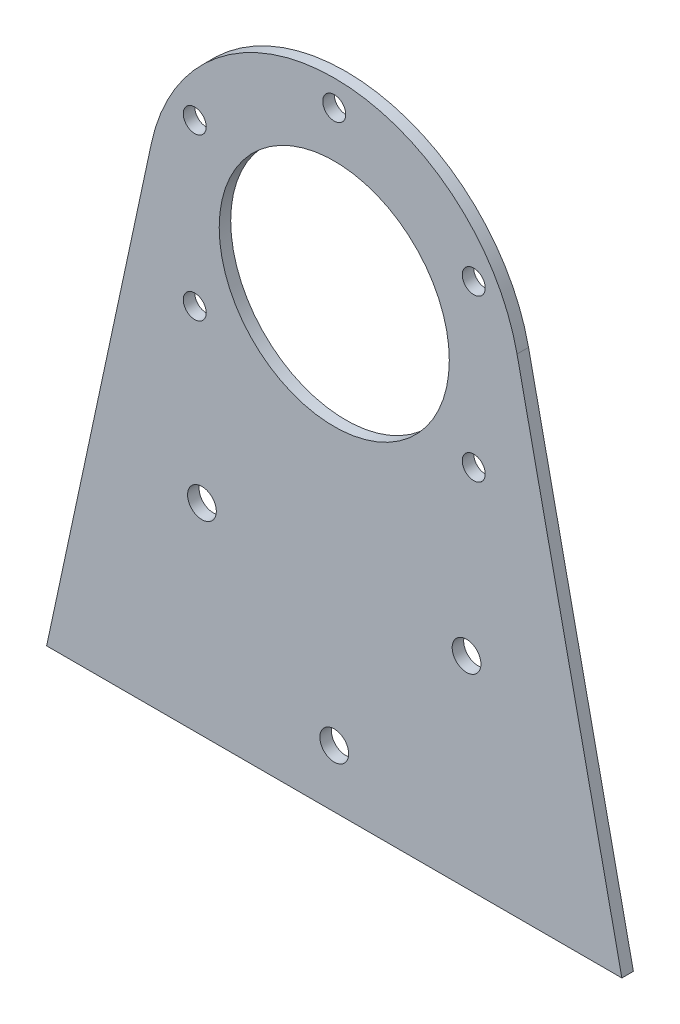
ISO-10303-21;
HEADER;
FILE_DESCRIPTION(('STEP AP214'),'2;1');
FILE_NAME('part.step','',(''),(''),'','','');
FILE_SCHEMA(('AUTOMOTIVE_DESIGN { 1 0 10303 214 1 1 1 1 }'));
ENDSEC;
DATA;
#1=APPLICATION_CONTEXT('core data for automotive mechanical design processes');
#2=APPLICATION_PROTOCOL_DEFINITION('international standard','automotive_design',2000,#1);
#3=PRODUCT_CONTEXT('',#1,'mechanical');
#4=PRODUCT('Part','Part','',(#3));
#5=PRODUCT_RELATED_PRODUCT_CATEGORY('part','',(#4));
#6=PRODUCT_DEFINITION_FORMATION('','',#4);
#7=PRODUCT_DEFINITION_CONTEXT('part definition',#1,'design');
#8=PRODUCT_DEFINITION('design','',#6,#7);
#9=PRODUCT_DEFINITION_SHAPE('','',#8);
#10=(LENGTH_UNIT() NAMED_UNIT(*) SI_UNIT(.MILLI.,.METRE.));
#11=(NAMED_UNIT(*) PLANE_ANGLE_UNIT() SI_UNIT($,.RADIAN.));
#12=(NAMED_UNIT(*) SI_UNIT($,.STERADIAN.) SOLID_ANGLE_UNIT());
#13=UNCERTAINTY_MEASURE_WITH_UNIT(LENGTH_MEASURE(1.E-05),#10,'distance_accuracy_value','');
#14=(GEOMETRIC_REPRESENTATION_CONTEXT(3) GLOBAL_UNCERTAINTY_ASSIGNED_CONTEXT((#13)) GLOBAL_UNIT_ASSIGNED_CONTEXT((#10,
#11,#12)) REPRESENTATION_CONTEXT('',''));
#15=CARTESIAN_POINT('',(0.,0.,0.));
#16=DIRECTION('',(0.,0.,1.));
#17=DIRECTION('',(1.,0.,0.));
#18=AXIS2_PLACEMENT_3D('',#15,#16,#17);
#19=CARTESIAN_POINT('',(0.,0.,2.));
#20=DIRECTION('',(0.,0.,1.));
#21=DIRECTION('',(1.,0.,0.));
#22=AXIS2_PLACEMENT_3D('',#19,#20,#21);
#23=PLANE('',#22);
#24=CARTESIAN_POINT('',(23.,-43.,2.));
#25=DIRECTION('',(0.,0.,1.));
#26=DIRECTION('',(1.,0.,0.));
#27=AXIS2_PLACEMENT_3D('',#24,#25,#26);
#28=CIRCLE('',#27,2.5);
#29=CARTESIAN_POINT('',(25.5,-43.,2.));
#30=VERTEX_POINT('',#29);
#31=EDGE_CURVE('E181',#30,#30,#28,.T.);
#32=ORIENTED_EDGE('',*,*,#31,.F.);
#33=EDGE_LOOP('',(#32));
#34=FACE_BOUND('',#33,.T.);
#35=CARTESIAN_POINT('',(-24.2487113059631,-14.0000000000007,2.));
#36=DIRECTION('',(0.,0.,1.));
#37=DIRECTION('',(1.,0.,0.));
#38=AXIS2_PLACEMENT_3D('',#35,#36,#37);
#39=CIRCLE('',#38,2.);
#40=CARTESIAN_POINT('',(-22.2487113059631,-14.0000000000007,2.));
#41=VERTEX_POINT('',#40);
#42=EDGE_CURVE('E165',#41,#41,#39,.T.);
#43=ORIENTED_EDGE('',*,*,#42,.F.);
#44=EDGE_LOOP('',(#43));
#45=FACE_BOUND('',#44,.T.);
#46=CARTESIAN_POINT('',(24.2487113059655,-13.9999999999993,2.));
#47=DIRECTION('',(0.,0.,1.));
#48=DIRECTION('',(1.,0.,0.));
#49=AXIS2_PLACEMENT_3D('',#46,#47,#48);
#50=CIRCLE('',#49,2.);
#51=CARTESIAN_POINT('',(26.2487113059655,-13.9999999999993,2.));
#52=VERTEX_POINT('',#51);
#53=EDGE_CURVE('E149',#52,#52,#50,.T.);
#54=ORIENTED_EDGE('',*,*,#53,.F.);
#55=EDGE_LOOP('',(#54));
#56=FACE_BOUND('',#55,.T.);
#57=CARTESIAN_POINT('',(0.,28.,2.));
#58=DIRECTION('',(0.,0.,1.));
#59=DIRECTION('',(1.,0.,0.));
#60=AXIS2_PLACEMENT_3D('',#57,#58,#59);
#61=CIRCLE('',#60,2.);
#62=CARTESIAN_POINT('',(2.,28.,2.));
#63=VERTEX_POINT('',#62);
#64=EDGE_CURVE('E133',#63,#63,#61,.T.);
#65=ORIENTED_EDGE('',*,*,#64,.F.);
#66=EDGE_LOOP('',(#65));
#67=FACE_BOUND('',#66,.T.);
#68=DIRECTION('',(-0.210057124610216,0.977689114391936,0.));
#69=VECTOR('',#68,1.);
#70=CARTESIAN_POINT('',(50.,-78.,2.));
#71=LINE('',#70,#69);
#72=CARTESIAN_POINT('',(50.,-78.,2.));
#73=VERTEX_POINT('',#72);
#74=CARTESIAN_POINT('',(31.7748962177379,6.82685654983201,2.));
#75=VERTEX_POINT('',#74);
#76=EDGE_CURVE('E88',#73,#75,#71,.T.);
#77=ORIENTED_EDGE('',*,*,#76,.T.);
#78=CARTESIAN_POINT('',(0.,0.,2.));
#79=DIRECTION('',(0.,0.,1.));
#80=DIRECTION('',(1.,0.,0.));
#81=AXIS2_PLACEMENT_3D('',#78,#79,#80);
#82=CIRCLE('',#81,32.5);
#83=CARTESIAN_POINT('',(-31.7748962177379,6.826856549832,2.));
#84=VERTEX_POINT('',#83);
#85=EDGE_CURVE('E83',#75,#84,#82,.T.);
#86=ORIENTED_EDGE('',*,*,#85,.T.);
#87=DIRECTION('',(-0.210057124610215,-0.977689114391936,0.));
#88=VECTOR('',#87,1.);
#89=CARTESIAN_POINT('',(-50.,-78.,2.));
#90=LINE('',#89,#88);
#91=CARTESIAN_POINT('',(-50.,-78.,2.));
#92=VERTEX_POINT('',#91);
#93=EDGE_CURVE('E86',#84,#92,#90,.T.);
#94=ORIENTED_EDGE('',*,*,#93,.T.);
#95=DIRECTION('',(1.,0.,0.));
#96=VECTOR('',#95,1.);
#97=CARTESIAN_POINT('',(-50.,-78.,2.));
#98=LINE('',#97,#96);
#99=EDGE_CURVE('E53',#92,#73,#98,.T.);
#100=ORIENTED_EDGE('',*,*,#99,.T.);
#101=EDGE_LOOP('',(#77,#86,#94,#100));
#102=FACE_BOUND('',#101,.T.);
#103=CARTESIAN_POINT('',(0.,0.,2.));
#104=DIRECTION('',(0.,0.,1.));
#105=DIRECTION('',(1.,0.,0.));
#106=AXIS2_PLACEMENT_3D('',#103,#104,#105);
#107=CIRCLE('',#106,20.);
#108=CARTESIAN_POINT('',(20.,0.,2.));
#109=VERTEX_POINT('',#108);
#110=EDGE_CURVE('E109',#109,#109,#107,.T.);
#111=ORIENTED_EDGE('',*,*,#110,.F.);
#112=EDGE_LOOP('',(#111));
#113=FACE_BOUND('',#112,.T.);
#114=CARTESIAN_POINT('',(24.2487113059647,14.0000000000007,2.));
#115=DIRECTION('',(0.,0.,1.));
#116=DIRECTION('',(1.,0.,0.));
#117=AXIS2_PLACEMENT_3D('',#114,#115,#116);
#118=CIRCLE('',#117,2.);
#119=CARTESIAN_POINT('',(26.2487113059647,14.0000000000007,2.));
#120=VERTEX_POINT('',#119);
#121=EDGE_CURVE('E141',#120,#120,#118,.T.);
#122=ORIENTED_EDGE('',*,*,#121,.F.);
#123=EDGE_LOOP('',(#122));
#124=FACE_BOUND('',#123,.T.);
#125=CARTESIAN_POINT('',(0.,-68.,2.));
#126=DIRECTION('',(0.,0.,1.));
#127=DIRECTION('',(1.,0.,0.));
#128=AXIS2_PLACEMENT_3D('',#125,#126,#127);
#129=CIRCLE('',#128,2.5);
#130=CARTESIAN_POINT('',(2.50000000000001,-68.,2.));
#131=VERTEX_POINT('',#130);
#132=EDGE_CURVE('E157',#131,#131,#129,.T.);
#133=ORIENTED_EDGE('',*,*,#132,.F.);
#134=EDGE_LOOP('',(#133));
#135=FACE_BOUND('',#134,.T.);
#136=CARTESIAN_POINT('',(-24.2487113059639,13.9999999999993,2.));
#137=DIRECTION('',(0.,0.,1.));
#138=DIRECTION('',(1.,0.,0.));
#139=AXIS2_PLACEMENT_3D('',#136,#137,#138);
#140=CIRCLE('',#139,2.);
#141=CARTESIAN_POINT('',(-22.2487113059639,13.9999999999993,2.));
#142=VERTEX_POINT('',#141);
#143=EDGE_CURVE('E173',#142,#142,#140,.T.);
#144=ORIENTED_EDGE('',*,*,#143,.F.);
#145=EDGE_LOOP('',(#144));
#146=FACE_BOUND('',#145,.T.);
#147=CARTESIAN_POINT('',(-23.,-43.,2.));
#148=DIRECTION('',(0.,0.,1.));
#149=DIRECTION('',(1.,0.,0.));
#150=AXIS2_PLACEMENT_3D('',#147,#148,#149);
#151=CIRCLE('',#150,2.5);
#152=CARTESIAN_POINT('',(-20.5,-43.,2.));
#153=VERTEX_POINT('',#152);
#154=EDGE_CURVE('E189',#153,#153,#151,.T.);
#155=ORIENTED_EDGE('',*,*,#154,.F.);
#156=EDGE_LOOP('',(#155));
#157=FACE_BOUND('',#156,.T.);
#158=ADVANCED_FACE('F35',(#34,#45,#56,#67,#102,#113,#124,#135,#146,#157),#23,.T.);
#159=CARTESIAN_POINT('',(0.,0.,0.));
#160=DIRECTION('',(0.,0.,1.));
#161=DIRECTION('',(1.,0.,0.));
#162=AXIS2_PLACEMENT_3D('',#159,#160,#161);
#163=PLANE('',#162);
#164=DIRECTION('',(-0.210057124610216,0.977689114391936,0.));
#165=VECTOR('',#164,1.);
#166=CARTESIAN_POINT('',(50.,-78.,0.));
#167=LINE('',#166,#165);
#168=CARTESIAN_POINT('',(50.,-78.,0.));
#169=VERTEX_POINT('',#168);
#170=CARTESIAN_POINT('',(31.7748962177379,6.82685654983201,0.));
#171=VERTEX_POINT('',#170);
#172=EDGE_CURVE('E105',#169,#171,#167,.T.);
#173=ORIENTED_EDGE('',*,*,#172,.F.);
#174=DIRECTION('',(1.,0.,0.));
#175=VECTOR('',#174,1.);
#176=CARTESIAN_POINT('',(-50.,-78.,0.));
#177=LINE('',#176,#175);
#178=CARTESIAN_POINT('',(-50.,-78.,0.));
#179=VERTEX_POINT('',#178);
#180=EDGE_CURVE('E76',#179,#169,#177,.T.);
#181=ORIENTED_EDGE('',*,*,#180,.F.);
#182=DIRECTION('',(-0.210057124610215,-0.977689114391936,0.));
#183=VECTOR('',#182,1.);
#184=CARTESIAN_POINT('',(-50.,-78.,0.));
#185=LINE('',#184,#183);
#186=CARTESIAN_POINT('',(-31.7748962177379,6.826856549832,0.));
#187=VERTEX_POINT('',#186);
#188=EDGE_CURVE('E70',#187,#179,#185,.T.);
#189=ORIENTED_EDGE('',*,*,#188,.F.);
#190=CARTESIAN_POINT('',(0.,0.,0.));
#191=DIRECTION('',(0.,0.,1.));
#192=DIRECTION('',(1.,0.,0.));
#193=AXIS2_PLACEMENT_3D('',#190,#191,#192);
#194=CIRCLE('',#193,32.5);
#195=EDGE_CURVE('E93',#171,#187,#194,.T.);
#196=ORIENTED_EDGE('',*,*,#195,.F.);
#197=EDGE_LOOP('',(#173,#181,#189,#196));
#198=FACE_BOUND('',#197,.T.);
#199=CARTESIAN_POINT('',(0.,0.,0.));
#200=DIRECTION('',(0.,0.,1.));
#201=DIRECTION('',(1.,0.,0.));
#202=AXIS2_PLACEMENT_3D('',#199,#200,#201);
#203=CIRCLE('',#202,20.);
#204=CARTESIAN_POINT('',(20.,0.,0.));
#205=VERTEX_POINT('',#204);
#206=EDGE_CURVE('E129',#205,#205,#203,.T.);
#207=ORIENTED_EDGE('',*,*,#206,.T.);
#208=EDGE_LOOP('',(#207));
#209=FACE_BOUND('',#208,.T.);
#210=CARTESIAN_POINT('',(0.,28.,0.));
#211=DIRECTION('',(0.,0.,1.));
#212=DIRECTION('',(1.,0.,0.));
#213=AXIS2_PLACEMENT_3D('',#210,#211,#212);
#214=CIRCLE('',#213,2.);
#215=CARTESIAN_POINT('',(2.,28.,0.));
#216=VERTEX_POINT('',#215);
#217=EDGE_CURVE('E137',#216,#216,#214,.T.);
#218=ORIENTED_EDGE('',*,*,#217,.T.);
#219=EDGE_LOOP('',(#218));
#220=FACE_BOUND('',#219,.T.);
#221=CARTESIAN_POINT('',(24.2487113059647,14.0000000000007,0.));
#222=DIRECTION('',(0.,0.,1.));
#223=DIRECTION('',(1.,0.,0.));
#224=AXIS2_PLACEMENT_3D('',#221,#222,#223);
#225=CIRCLE('',#224,2.);
#226=CARTESIAN_POINT('',(26.2487113059647,14.0000000000007,0.));
#227=VERTEX_POINT('',#226);
#228=EDGE_CURVE('E145',#227,#227,#225,.T.);
#229=ORIENTED_EDGE('',*,*,#228,.T.);
#230=EDGE_LOOP('',(#229));
#231=FACE_BOUND('',#230,.T.);
#232=CARTESIAN_POINT('',(24.2487113059655,-13.9999999999993,0.));
#233=DIRECTION('',(0.,0.,1.));
#234=DIRECTION('',(1.,0.,0.));
#235=AXIS2_PLACEMENT_3D('',#232,#233,#234);
#236=CIRCLE('',#235,2.);
#237=CARTESIAN_POINT('',(26.2487113059655,-13.9999999999993,0.));
#238=VERTEX_POINT('',#237);
#239=EDGE_CURVE('E153',#238,#238,#236,.T.);
#240=ORIENTED_EDGE('',*,*,#239,.T.);
#241=EDGE_LOOP('',(#240));
#242=FACE_BOUND('',#241,.T.);
#243=CARTESIAN_POINT('',(0.,-68.,0.));
#244=DIRECTION('',(0.,0.,1.));
#245=DIRECTION('',(1.,0.,0.));
#246=AXIS2_PLACEMENT_3D('',#243,#244,#245);
#247=CIRCLE('',#246,2.5);
#248=CARTESIAN_POINT('',(2.50000000000001,-68.,0.));
#249=VERTEX_POINT('',#248);
#250=EDGE_CURVE('E161',#249,#249,#247,.T.);
#251=ORIENTED_EDGE('',*,*,#250,.T.);
#252=EDGE_LOOP('',(#251));
#253=FACE_BOUND('',#252,.T.);
#254=CARTESIAN_POINT('',(-24.2487113059631,-14.0000000000007,0.));
#255=DIRECTION('',(0.,0.,1.));
#256=DIRECTION('',(1.,0.,0.));
#257=AXIS2_PLACEMENT_3D('',#254,#255,#256);
#258=CIRCLE('',#257,2.);
#259=CARTESIAN_POINT('',(-22.2487113059631,-14.0000000000007,0.));
#260=VERTEX_POINT('',#259);
#261=EDGE_CURVE('E169',#260,#260,#258,.T.);
#262=ORIENTED_EDGE('',*,*,#261,.T.);
#263=EDGE_LOOP('',(#262));
#264=FACE_BOUND('',#263,.T.);
#265=CARTESIAN_POINT('',(-24.2487113059639,13.9999999999993,0.));
#266=DIRECTION('',(0.,0.,1.));
#267=DIRECTION('',(1.,0.,0.));
#268=AXIS2_PLACEMENT_3D('',#265,#266,#267);
#269=CIRCLE('',#268,2.);
#270=CARTESIAN_POINT('',(-22.2487113059639,13.9999999999993,0.));
#271=VERTEX_POINT('',#270);
#272=EDGE_CURVE('E177',#271,#271,#269,.T.);
#273=ORIENTED_EDGE('',*,*,#272,.T.);
#274=EDGE_LOOP('',(#273));
#275=FACE_BOUND('',#274,.T.);
#276=CARTESIAN_POINT('',(23.,-43.,0.));
#277=DIRECTION('',(0.,0.,1.));
#278=DIRECTION('',(1.,0.,0.));
#279=AXIS2_PLACEMENT_3D('',#276,#277,#278);
#280=CIRCLE('',#279,2.5);
#281=CARTESIAN_POINT('',(25.5,-43.,0.));
#282=VERTEX_POINT('',#281);
#283=EDGE_CURVE('E185',#282,#282,#280,.T.);
#284=ORIENTED_EDGE('',*,*,#283,.T.);
#285=EDGE_LOOP('',(#284));
#286=FACE_BOUND('',#285,.T.);
#287=CARTESIAN_POINT('',(-23.,-43.,0.));
#288=DIRECTION('',(0.,0.,1.));
#289=DIRECTION('',(1.,0.,0.));
#290=AXIS2_PLACEMENT_3D('',#287,#288,#289);
#291=CIRCLE('',#290,2.5);
#292=CARTESIAN_POINT('',(-20.5,-43.,0.));
#293=VERTEX_POINT('',#292);
#294=EDGE_CURVE('E193',#293,#293,#291,.T.);
#295=ORIENTED_EDGE('',*,*,#294,.T.);
#296=EDGE_LOOP('',(#295));
#297=FACE_BOUND('',#296,.T.);
#298=ADVANCED_FACE('F123',(#198,#209,#220,#231,#242,#253,#264,#275,#286,#297),#163,.F.);
#299=CARTESIAN_POINT('',(50.,-78.,2.));
#300=DIRECTION('',(-0.977689114391936,-0.210057124610216,0.));
#301=DIRECTION('',(0.210057124610216,-0.977689114391936,0.));
#302=AXIS2_PLACEMENT_3D('',#299,#300,#301);
#303=PLANE('',#302);
#304=ORIENTED_EDGE('',*,*,#172,.T.);
#305=DIRECTION('',(0.,0.,-1.));
#306=VECTOR('',#305,1.);
#307=CARTESIAN_POINT('',(31.7748962177379,6.82685654983201,2.));
#308=LINE('',#307,#306);
#309=EDGE_CURVE('E11',#75,#171,#308,.T.);
#310=ORIENTED_EDGE('',*,*,#309,.F.);
#311=ORIENTED_EDGE('',*,*,#76,.F.);
#312=DIRECTION('',(0.,0.,-1.));
#313=VECTOR('',#312,1.);
#314=CARTESIAN_POINT('',(50.,-78.,2.));
#315=LINE('',#314,#313);
#316=EDGE_CURVE('E101',#73,#169,#315,.T.);
#317=ORIENTED_EDGE('',*,*,#316,.T.);
#318=EDGE_LOOP('',(#304,#310,#311,#317));
#319=FACE_BOUND('',#318,.T.);
#320=ADVANCED_FACE('F37',(#319),#303,.F.);
#321=CARTESIAN_POINT('',(0.,0.,2.));
#322=DIRECTION('',(0.,0.,-1.));
#323=DIRECTION('',(-1.,0.,0.));
#324=AXIS2_PLACEMENT_3D('',#321,#322,#323);
#325=CYLINDRICAL_SURFACE('',#324,32.5);
#326=ORIENTED_EDGE('',*,*,#195,.T.);
#327=DIRECTION('',(0.,0.,-1.));
#328=VECTOR('',#327,1.);
#329=CARTESIAN_POINT('',(-31.7748962177379,6.826856549832,2.));
#330=LINE('',#329,#328);
#331=EDGE_CURVE('E45',#84,#187,#330,.T.);
#332=ORIENTED_EDGE('',*,*,#331,.F.);
#333=ORIENTED_EDGE('',*,*,#85,.F.);
#334=ORIENTED_EDGE('',*,*,#309,.T.);
#335=EDGE_LOOP('',(#326,#332,#333,#334));
#336=FACE_BOUND('',#335,.T.);
#337=ADVANCED_FACE('F92',(#336),#325,.T.);
#338=CARTESIAN_POINT('',(-50.,-78.,2.));
#339=DIRECTION('',(0.977689114391936,-0.210057124610215,0.));
#340=DIRECTION('',(0.210057124610215,0.977689114391936,0.));
#341=AXIS2_PLACEMENT_3D('',#338,#339,#340);
#342=PLANE('',#341);
#343=ORIENTED_EDGE('',*,*,#188,.T.);
#344=DIRECTION('',(0.,0.,-1.));
#345=VECTOR('',#344,1.);
#346=CARTESIAN_POINT('',(-50.,-78.,2.));
#347=LINE('',#346,#345);
#348=EDGE_CURVE('E95',#92,#179,#347,.T.);
#349=ORIENTED_EDGE('',*,*,#348,.F.);
#350=ORIENTED_EDGE('',*,*,#93,.F.);
#351=ORIENTED_EDGE('',*,*,#331,.T.);
#352=EDGE_LOOP('',(#343,#349,#350,#351));
#353=FACE_BOUND('',#352,.T.);
#354=ADVANCED_FACE('F96',(#353),#342,.F.);
#355=CARTESIAN_POINT('',(-50.,-78.,2.));
#356=DIRECTION('',(0.,1.,0.));
#357=DIRECTION('',(0.,0.,1.));
#358=AXIS2_PLACEMENT_3D('',#355,#356,#357);
#359=PLANE('',#358);
#360=ORIENTED_EDGE('',*,*,#180,.T.);
#361=ORIENTED_EDGE('',*,*,#316,.F.);
#362=ORIENTED_EDGE('',*,*,#99,.F.);
#363=ORIENTED_EDGE('',*,*,#348,.T.);
#364=EDGE_LOOP('',(#360,#361,#362,#363));
#365=FACE_BOUND('',#364,.T.);
#366=ADVANCED_FACE('F120',(#365),#359,.F.);
#367=CARTESIAN_POINT('',(0.,0.,2.));
#368=DIRECTION('',(0.,0.,-1.));
#369=DIRECTION('',(-1.,0.,0.));
#370=AXIS2_PLACEMENT_3D('',#367,#368,#369);
#371=CYLINDRICAL_SURFACE('',#370,20.);
#372=ORIENTED_EDGE('',*,*,#110,.T.);
#373=EDGE_LOOP('',(#372));
#374=FACE_BOUND('',#373,.T.);
#375=ORIENTED_EDGE('',*,*,#206,.F.);
#376=EDGE_LOOP('',(#375));
#377=FACE_BOUND('',#376,.T.);
#378=ADVANCED_FACE('F215',(#374,#377),#371,.F.);
#379=CARTESIAN_POINT('',(0.,28.,2.));
#380=DIRECTION('',(0.,0.,-1.));
#381=DIRECTION('',(-1.,0.,0.));
#382=AXIS2_PLACEMENT_3D('',#379,#380,#381);
#383=CYLINDRICAL_SURFACE('',#382,2.);
#384=ORIENTED_EDGE('',*,*,#64,.T.);
#385=EDGE_LOOP('',(#384));
#386=FACE_BOUND('',#385,.T.);
#387=ORIENTED_EDGE('',*,*,#217,.F.);
#388=EDGE_LOOP('',(#387));
#389=FACE_BOUND('',#388,.T.);
#390=ADVANCED_FACE('F270',(#386,#389),#383,.F.);
#391=CARTESIAN_POINT('',(24.2487113059647,14.0000000000007,2.));
#392=DIRECTION('',(0.,0.,-1.));
#393=DIRECTION('',(-1.,0.,0.));
#394=AXIS2_PLACEMENT_3D('',#391,#392,#393);
#395=CYLINDRICAL_SURFACE('',#394,2.);
#396=ORIENTED_EDGE('',*,*,#121,.T.);
#397=EDGE_LOOP('',(#396));
#398=FACE_BOUND('',#397,.T.);
#399=ORIENTED_EDGE('',*,*,#228,.F.);
#400=EDGE_LOOP('',(#399));
#401=FACE_BOUND('',#400,.T.);
#402=ADVANCED_FACE('F279',(#398,#401),#395,.F.);
#403=CARTESIAN_POINT('',(24.2487113059655,-13.9999999999993,2.));
#404=DIRECTION('',(0.,0.,-1.));
#405=DIRECTION('',(-1.,0.,0.));
#406=AXIS2_PLACEMENT_3D('',#403,#404,#405);
#407=CYLINDRICAL_SURFACE('',#406,2.);
#408=ORIENTED_EDGE('',*,*,#53,.T.);
#409=EDGE_LOOP('',(#408));
#410=FACE_BOUND('',#409,.T.);
#411=ORIENTED_EDGE('',*,*,#239,.F.);
#412=EDGE_LOOP('',(#411));
#413=FACE_BOUND('',#412,.T.);
#414=ADVANCED_FACE('F288',(#410,#413),#407,.F.);
#415=CARTESIAN_POINT('',(0.,-68.,2.));
#416=DIRECTION('',(0.,0.,-1.));
#417=DIRECTION('',(-1.,0.,0.));
#418=AXIS2_PLACEMENT_3D('',#415,#416,#417);
#419=CYLINDRICAL_SURFACE('',#418,2.5);
#420=ORIENTED_EDGE('',*,*,#132,.T.);
#421=EDGE_LOOP('',(#420));
#422=FACE_BOUND('',#421,.T.);
#423=ORIENTED_EDGE('',*,*,#250,.F.);
#424=EDGE_LOOP('',(#423));
#425=FACE_BOUND('',#424,.T.);
#426=ADVANCED_FACE('F298',(#422,#425),#419,.F.);
#427=CARTESIAN_POINT('',(-24.2487113059631,-14.0000000000007,2.));
#428=DIRECTION('',(0.,0.,-1.));
#429=DIRECTION('',(-1.,0.,0.));
#430=AXIS2_PLACEMENT_3D('',#427,#428,#429);
#431=CYLINDRICAL_SURFACE('',#430,2.);
#432=ORIENTED_EDGE('',*,*,#42,.T.);
#433=EDGE_LOOP('',(#432));
#434=FACE_BOUND('',#433,.T.);
#435=ORIENTED_EDGE('',*,*,#261,.F.);
#436=EDGE_LOOP('',(#435));
#437=FACE_BOUND('',#436,.T.);
#438=ADVANCED_FACE('F308',(#434,#437),#431,.F.);
#439=CARTESIAN_POINT('',(-24.2487113059639,13.9999999999993,2.));
#440=DIRECTION('',(0.,0.,-1.));
#441=DIRECTION('',(-1.,0.,0.));
#442=AXIS2_PLACEMENT_3D('',#439,#440,#441);
#443=CYLINDRICAL_SURFACE('',#442,2.);
#444=ORIENTED_EDGE('',*,*,#143,.T.);
#445=EDGE_LOOP('',(#444));
#446=FACE_BOUND('',#445,.T.);
#447=ORIENTED_EDGE('',*,*,#272,.F.);
#448=EDGE_LOOP('',(#447));
#449=FACE_BOUND('',#448,.T.);
#450=ADVANCED_FACE('F318',(#446,#449),#443,.F.);
#451=CARTESIAN_POINT('',(23.,-43.,2.));
#452=DIRECTION('',(0.,0.,-1.));
#453=DIRECTION('',(-1.,0.,0.));
#454=AXIS2_PLACEMENT_3D('',#451,#452,#453);
#455=CYLINDRICAL_SURFACE('',#454,2.5);
#456=ORIENTED_EDGE('',*,*,#31,.T.);
#457=EDGE_LOOP('',(#456));
#458=FACE_BOUND('',#457,.T.);
#459=ORIENTED_EDGE('',*,*,#283,.F.);
#460=EDGE_LOOP('',(#459));
#461=FACE_BOUND('',#460,.T.);
#462=ADVANCED_FACE('F328',(#458,#461),#455,.F.);
#463=CARTESIAN_POINT('',(-23.,-43.,2.));
#464=DIRECTION('',(0.,0.,-1.));
#465=DIRECTION('',(-1.,0.,0.));
#466=AXIS2_PLACEMENT_3D('',#463,#464,#465);
#467=CYLINDRICAL_SURFACE('',#466,2.5);
#468=ORIENTED_EDGE('',*,*,#154,.T.);
#469=EDGE_LOOP('',(#468));
#470=FACE_BOUND('',#469,.T.);
#471=ORIENTED_EDGE('',*,*,#294,.F.);
#472=EDGE_LOOP('',(#471));
#473=FACE_BOUND('',#472,.T.);
#474=ADVANCED_FACE('F202',(#470,#473),#467,.F.);
#475=CLOSED_SHELL('',(#158,#298,#320,#337,#354,#366,#378,#390,#402,#414,#426,#438,#450,#462,#474));
#476=MANIFOLD_SOLID_BREP('B2',#475);
#477=ADVANCED_BREP_SHAPE_REPRESENTATION('',(#18,#476),#14);
#478=SHAPE_DEFINITION_REPRESENTATION(#9,#477);
ENDSEC;
END-ISO-10303-21;
